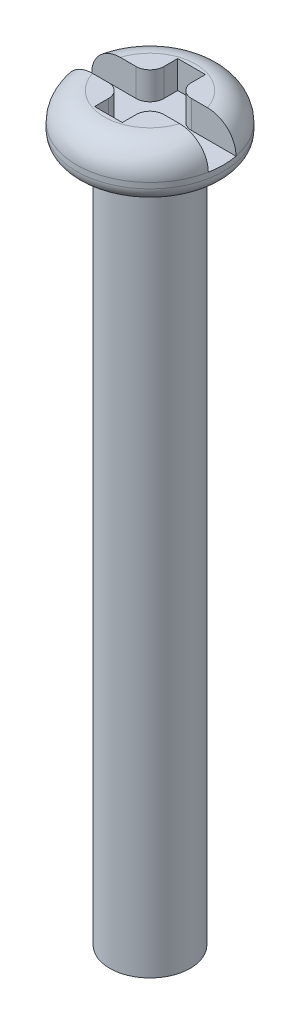
ISO-10303-21;
HEADER;
FILE_DESCRIPTION(('STEP AP214'),'2;1');
FILE_NAME('part.step','',(''),(''),'','','');
FILE_SCHEMA(('AUTOMOTIVE_DESIGN { 1 0 10303 214 1 1 1 1 }'));
ENDSEC;
DATA;
#1=APPLICATION_CONTEXT('core data for automotive mechanical design processes');
#2=APPLICATION_PROTOCOL_DEFINITION('international standard','automotive_design',2000,#1);
#3=PRODUCT_CONTEXT('',#1,'mechanical');
#4=PRODUCT('Part','Part','',(#3));
#5=PRODUCT_RELATED_PRODUCT_CATEGORY('part','',(#4));
#6=PRODUCT_DEFINITION_FORMATION('','',#4);
#7=PRODUCT_DEFINITION_CONTEXT('part definition',#1,'design');
#8=PRODUCT_DEFINITION('design','',#6,#7);
#9=PRODUCT_DEFINITION_SHAPE('','',#8);
#10=(LENGTH_UNIT() NAMED_UNIT(*) SI_UNIT(.MILLI.,.METRE.));
#11=(NAMED_UNIT(*) PLANE_ANGLE_UNIT() SI_UNIT($,.RADIAN.));
#12=(NAMED_UNIT(*) SI_UNIT($,.STERADIAN.) SOLID_ANGLE_UNIT());
#13=UNCERTAINTY_MEASURE_WITH_UNIT(LENGTH_MEASURE(1.E-05),#10,'distance_accuracy_value','');
#14=(GEOMETRIC_REPRESENTATION_CONTEXT(3) GLOBAL_UNCERTAINTY_ASSIGNED_CONTEXT((#13)) GLOBAL_UNIT_ASSIGNED_CONTEXT((#10,
#11,#12)) REPRESENTATION_CONTEXT('',''));
#15=CARTESIAN_POINT('',(0.,0.,0.));
#16=DIRECTION('',(0.,0.,1.));
#17=DIRECTION('',(1.,0.,0.));
#18=AXIS2_PLACEMENT_3D('',#15,#16,#17);
#19=CARTESIAN_POINT('',(0.,26.7,0.));
#20=DIRECTION('',(0.,-1.,0.));
#21=DIRECTION('',(0.,0.,-1.));
#22=AXIS2_PLACEMENT_3D('',#19,#20,#21);
#23=CYLINDRICAL_SURFACE('',#22,2.65);
#24=CARTESIAN_POINT('',(0.,25.5,0.));
#25=DIRECTION('',(0.,1.,0.));
#26=DIRECTION('',(0.,0.,1.));
#27=AXIS2_PLACEMENT_3D('',#24,#25,#26);
#28=CIRCLE('',#27,2.65);
#29=CARTESIAN_POINT('',(0.,25.5,2.65));
#30=VERTEX_POINT('',#29);
#31=EDGE_CURVE('E46',#30,#30,#28,.T.);
#32=ORIENTED_EDGE('',*,*,#31,.T.);
#33=EDGE_LOOP('',(#32));
#34=FACE_BOUND('',#33,.T.);
#35=CARTESIAN_POINT('',(0.,25.7,0.));
#36=DIRECTION('',(0.,1.,0.));
#37=DIRECTION('',(0.,0.,1.));
#38=AXIS2_PLACEMENT_3D('',#35,#36,#37);
#39=CIRCLE('',#38,2.65);
#40=CARTESIAN_POINT('',(-2.60240273593462,25.7,-0.5));
#41=VERTEX_POINT('',#40);
#42=CARTESIAN_POINT('',(-2.60240273593462,25.7,0.5));
#43=VERTEX_POINT('',#42);
#44=EDGE_CURVE('E176',#41,#43,#39,.T.);
#45=ORIENTED_EDGE('',*,*,#44,.F.);
#46=CARTESIAN_POINT('',(0.,25.7,0.));
#47=DIRECTION('',(0.,1.,0.));
#48=DIRECTION('',(0.,0.,1.));
#49=AXIS2_PLACEMENT_3D('',#46,#47,#48);
#50=CIRCLE('',#49,2.65);
#51=CARTESIAN_POINT('',(2.60240273593462,25.7,-0.5));
#52=VERTEX_POINT('',#51);
#53=EDGE_CURVE('E312',#41,#52,#50,.F.);
#54=ORIENTED_EDGE('',*,*,#53,.T.);
#55=CARTESIAN_POINT('',(0.,25.7,0.));
#56=DIRECTION('',(0.,1.,0.));
#57=DIRECTION('',(0.,0.,1.));
#58=AXIS2_PLACEMENT_3D('',#55,#56,#57);
#59=CIRCLE('',#58,2.65);
#60=CARTESIAN_POINT('',(2.60240273593462,25.7,0.5));
#61=VERTEX_POINT('',#60);
#62=EDGE_CURVE('E189',#61,#52,#59,.T.);
#63=ORIENTED_EDGE('',*,*,#62,.F.);
#64=CARTESIAN_POINT('',(0.,25.7,0.));
#65=DIRECTION('',(0.,1.,0.));
#66=DIRECTION('',(0.,0.,1.));
#67=AXIS2_PLACEMENT_3D('',#64,#65,#66);
#68=CIRCLE('',#67,2.65);
#69=EDGE_CURVE('E288',#61,#43,#68,.F.);
#70=ORIENTED_EDGE('',*,*,#69,.T.);
#71=EDGE_LOOP('',(#45,#54,#63,#70));
#72=FACE_BOUND('',#71,.T.);
#73=ADVANCED_FACE('F38',(#34,#72),#23,.T.);
#74=CARTESIAN_POINT('',(0.,26.7,0.));
#75=DIRECTION('',(0.,1.,0.));
#76=DIRECTION('',(0.,0.,1.));
#77=AXIS2_PLACEMENT_3D('',#74,#75,#76);
#78=PLANE('',#77);
#79=DIRECTION('',(1.,0.,0.));
#80=VECTOR('',#79,1.);
#81=CARTESIAN_POINT('',(0.,26.7,-0.5));
#82=LINE('',#81,#80);
#83=CARTESIAN_POINT('',(1.,26.7,-0.5));
#84=VERTEX_POINT('',#83);
#85=CARTESIAN_POINT('',(1.57241851935164,26.7,-0.5));
#86=VERTEX_POINT('',#85);
#87=EDGE_CURVE('E218',#84,#86,#82,.T.);
#88=ORIENTED_EDGE('',*,*,#87,.T.);
#89=CARTESIAN_POINT('',(0.,26.7,0.));
#90=DIRECTION('',(0.,1.,0.));
#91=DIRECTION('',(0.,0.,1.));
#92=AXIS2_PLACEMENT_3D('',#89,#90,#91);
#93=CIRCLE('',#92,1.65);
#94=CARTESIAN_POINT('',(-1.57241851935164,26.7,-0.5));
#95=VERTEX_POINT('',#94);
#96=EDGE_CURVE('E278',#86,#95,#93,.T.);
#97=ORIENTED_EDGE('',*,*,#96,.T.);
#98=DIRECTION('',(1.,0.,0.));
#99=VECTOR('',#98,1.);
#100=CARTESIAN_POINT('',(0.,26.7,-0.5));
#101=LINE('',#100,#99);
#102=CARTESIAN_POINT('',(-0.999999999999998,26.7,-0.5));
#103=VERTEX_POINT('',#102);
#104=EDGE_CURVE('E230',#95,#103,#101,.T.);
#105=ORIENTED_EDGE('',*,*,#104,.T.);
#106=CARTESIAN_POINT('',(-0.999999999999998,26.7,-1.));
#107=DIRECTION('',(0.,1.,0.));
#108=DIRECTION('',(0.,0.,1.));
#109=AXIS2_PLACEMENT_3D('',#106,#107,#108);
#110=CIRCLE('',#109,0.5);
#111=CARTESIAN_POINT('',(-0.499999999999998,26.7,-1.));
#112=VERTEX_POINT('',#111);
#113=EDGE_CURVE('E246',#103,#112,#110,.T.);
#114=ORIENTED_EDGE('',*,*,#113,.T.);
#115=DIRECTION('',(0.,0.,1.));
#116=VECTOR('',#115,1.);
#117=CARTESIAN_POINT('',(-0.499999999999998,26.7,0.));
#118=LINE('',#117,#116);
#119=CARTESIAN_POINT('',(-0.499999999999998,26.7,-1.5));
#120=VERTEX_POINT('',#119);
#121=EDGE_CURVE('E227',#120,#112,#118,.T.);
#122=ORIENTED_EDGE('',*,*,#121,.F.);
#123=DIRECTION('',(1.,0.,0.));
#124=VECTOR('',#123,1.);
#125=CARTESIAN_POINT('',(0.,26.7,-1.5));
#126=LINE('',#125,#124);
#127=CARTESIAN_POINT('',(0.500000000000002,26.7,-1.5));
#128=VERTEX_POINT('',#127);
#129=EDGE_CURVE('E224',#120,#128,#126,.T.);
#130=ORIENTED_EDGE('',*,*,#129,.T.);
#131=DIRECTION('',(0.,0.,1.));
#132=VECTOR('',#131,1.);
#133=CARTESIAN_POINT('',(0.500000000000002,26.7,0.));
#134=LINE('',#133,#132);
#135=CARTESIAN_POINT('',(0.500000000000002,26.7,-1.));
#136=VERTEX_POINT('',#135);
#137=EDGE_CURVE('E221',#128,#136,#134,.T.);
#138=ORIENTED_EDGE('',*,*,#137,.T.);
#139=CARTESIAN_POINT('',(1.,26.7,-1.));
#140=DIRECTION('',(0.,1.,0.));
#141=DIRECTION('',(0.,0.,1.));
#142=AXIS2_PLACEMENT_3D('',#139,#140,#141);
#143=CIRCLE('',#142,0.5);
#144=EDGE_CURVE('E248',#136,#84,#143,.T.);
#145=ORIENTED_EDGE('',*,*,#144,.T.);
#146=EDGE_LOOP('',(#88,#97,#105,#114,#122,#130,#138,#145));
#147=FACE_BOUND('',#146,.T.);
#148=ADVANCED_FACE('F348',(#147),#78,.T.);
#149=CARTESIAN_POINT('',(0.,25.,0.));
#150=DIRECTION('',(0.,-1.,0.));
#151=DIRECTION('',(0.,0.,-1.));
#152=AXIS2_PLACEMENT_3D('',#149,#150,#151);
#153=CYLINDRICAL_SURFACE('',#152,1.45);
#154=CARTESIAN_POINT('',(0.,25.,0.));
#155=DIRECTION('',(0.,1.,0.));
#156=DIRECTION('',(0.,0.,1.));
#157=AXIS2_PLACEMENT_3D('',#154,#155,#156);
#158=CIRCLE('',#157,1.45);
#159=CARTESIAN_POINT('',(0.,25.,1.45));
#160=VERTEX_POINT('',#159);
#161=EDGE_CURVE('E238',#160,#160,#158,.T.);
#162=ORIENTED_EDGE('',*,*,#161,.F.);
#163=EDGE_LOOP('',(#162));
#164=FACE_BOUND('',#163,.T.);
#165=CARTESIAN_POINT('',(0.,0.,0.));
#166=DIRECTION('',(0.,1.,0.));
#167=DIRECTION('',(0.,0.,1.));
#168=AXIS2_PLACEMENT_3D('',#165,#166,#167);
#169=CIRCLE('',#168,1.45);
#170=CARTESIAN_POINT('',(0.,0.,1.45));
#171=VERTEX_POINT('',#170);
#172=EDGE_CURVE('E234',#171,#171,#169,.T.);
#173=ORIENTED_EDGE('',*,*,#172,.T.);
#174=EDGE_LOOP('',(#173));
#175=FACE_BOUND('',#174,.T.);
#176=ADVANCED_FACE('F357',(#164,#175),#153,.T.);
#177=CARTESIAN_POINT('',(0.,0.,0.));
#178=DIRECTION('',(0.,1.,0.));
#179=DIRECTION('',(0.,0.,1.));
#180=AXIS2_PLACEMENT_3D('',#177,#178,#179);
#181=PLANE('',#180);
#182=ORIENTED_EDGE('',*,*,#172,.F.);
#183=EDGE_LOOP('',(#182));
#184=FACE_BOUND('',#183,.T.);
#185=ADVANCED_FACE('F346',(#184),#181,.F.);
#186=DIRECTION('',(1.,0.,0.));
#187=VECTOR('',#186,1.);
#188=CARTESIAN_POINT('',(0.,26.7,0.5));
#189=LINE('',#188,#187);
#190=CARTESIAN_POINT('',(-1.57241851935164,26.7,0.5));
#191=VERTEX_POINT('',#190);
#192=CARTESIAN_POINT('',(-0.999999999999998,26.7,0.5));
#193=VERTEX_POINT('',#192);
#194=EDGE_CURVE('E208',#191,#193,#189,.T.);
#195=ORIENTED_EDGE('',*,*,#194,.F.);
#196=CARTESIAN_POINT('',(0.,26.7,0.));
#197=DIRECTION('',(0.,1.,0.));
#198=DIRECTION('',(0.,0.,1.));
#199=AXIS2_PLACEMENT_3D('',#196,#197,#198);
#200=CIRCLE('',#199,1.65);
#201=CARTESIAN_POINT('',(1.57241851935164,26.7,0.5));
#202=VERTEX_POINT('',#201);
#203=EDGE_CURVE('E311',#191,#202,#200,.T.);
#204=ORIENTED_EDGE('',*,*,#203,.T.);
#205=DIRECTION('',(1.,0.,0.));
#206=VECTOR('',#205,1.);
#207=CARTESIAN_POINT('',(0.,26.7,0.5));
#208=LINE('',#207,#206);
#209=CARTESIAN_POINT('',(1.,26.7,0.5));
#210=VERTEX_POINT('',#209);
#211=EDGE_CURVE('E215',#210,#202,#208,.T.);
#212=ORIENTED_EDGE('',*,*,#211,.F.);
#213=CARTESIAN_POINT('',(1.,26.7,1.));
#214=DIRECTION('',(0.,1.,0.));
#215=DIRECTION('',(0.,0.,1.));
#216=AXIS2_PLACEMENT_3D('',#213,#214,#215);
#217=CIRCLE('',#216,0.5);
#218=CARTESIAN_POINT('',(0.500000000000002,26.7,1.));
#219=VERTEX_POINT('',#218);
#220=EDGE_CURVE('E258',#210,#219,#217,.T.);
#221=ORIENTED_EDGE('',*,*,#220,.T.);
#222=DIRECTION('',(0.,0.,1.));
#223=VECTOR('',#222,1.);
#224=CARTESIAN_POINT('',(0.500000000000002,26.7,0.));
#225=LINE('',#224,#223);
#226=CARTESIAN_POINT('',(0.500000000000002,26.7,1.5));
#227=VERTEX_POINT('',#226);
#228=EDGE_CURVE('E213',#219,#227,#225,.T.);
#229=ORIENTED_EDGE('',*,*,#228,.T.);
#230=DIRECTION('',(1.,0.,0.));
#231=VECTOR('',#230,1.);
#232=CARTESIAN_POINT('',(0.,26.7,1.5));
#233=LINE('',#232,#231);
#234=CARTESIAN_POINT('',(-0.499999999999998,26.7,1.5));
#235=VERTEX_POINT('',#234);
#236=EDGE_CURVE('E211',#235,#227,#233,.T.);
#237=ORIENTED_EDGE('',*,*,#236,.F.);
#238=DIRECTION('',(0.,0.,1.));
#239=VECTOR('',#238,1.);
#240=CARTESIAN_POINT('',(-0.499999999999998,26.7,0.));
#241=LINE('',#240,#239);
#242=CARTESIAN_POINT('',(-0.499999999999998,26.7,1.));
#243=VERTEX_POINT('',#242);
#244=EDGE_CURVE('E171',#243,#235,#241,.T.);
#245=ORIENTED_EDGE('',*,*,#244,.F.);
#246=CARTESIAN_POINT('',(-0.999999999999998,26.7,1.));
#247=DIRECTION('',(0.,1.,0.));
#248=DIRECTION('',(0.,0.,1.));
#249=AXIS2_PLACEMENT_3D('',#246,#247,#248);
#250=CIRCLE('',#249,0.5);
#251=EDGE_CURVE('E255',#243,#193,#250,.T.);
#252=ORIENTED_EDGE('',*,*,#251,.T.);
#253=EDGE_LOOP('',(#195,#204,#212,#221,#229,#237,#245,#252));
#254=FACE_BOUND('',#253,.T.);
#255=ADVANCED_FACE('F343',(#254),#78,.T.);
#256=CARTESIAN_POINT('',(0.,25.,0.));
#257=DIRECTION('',(0.,1.,0.));
#258=DIRECTION('',(0.,0.,1.));
#259=AXIS2_PLACEMENT_3D('',#256,#257,#258);
#260=PLANE('',#259);
#261=CARTESIAN_POINT('',(0.,25.,0.));
#262=DIRECTION('',(0.,1.,0.));
#263=DIRECTION('',(0.,0.,1.));
#264=AXIS2_PLACEMENT_3D('',#261,#262,#263);
#265=CIRCLE('',#264,2.15);
#266=CARTESIAN_POINT('',(0.,25.,2.15));
#267=VERTEX_POINT('',#266);
#268=EDGE_CURVE('E11',#267,#267,#265,.F.);
#269=ORIENTED_EDGE('',*,*,#268,.T.);
#270=EDGE_LOOP('',(#269));
#271=FACE_BOUND('',#270,.T.);
#272=ORIENTED_EDGE('',*,*,#161,.T.);
#273=EDGE_LOOP('',(#272));
#274=FACE_BOUND('',#273,.T.);
#275=ADVANCED_FACE('F342',(#271,#274),#260,.F.);
#276=CARTESIAN_POINT('',(0.,25.7,0.5));
#277=DIRECTION('',(0.,0.,1.));
#278=DIRECTION('',(1.,0.,0.));
#279=AXIS2_PLACEMENT_3D('',#276,#277,#278);
#280=PLANE('',#279);
#281=DIRECTION('',(1.,0.,0.));
#282=VECTOR('',#281,1.);
#283=CARTESIAN_POINT('',(0.,25.7,0.5));
#284=LINE('',#283,#282);
#285=CARTESIAN_POINT('',(-0.999999999999998,25.7,0.5));
#286=VERTEX_POINT('',#285);
#287=EDGE_CURVE('E165',#43,#286,#284,.T.);
#288=ORIENTED_EDGE('',*,*,#287,.F.);
#289=CARTESIAN_POINT('',(-2.60240273593462,25.7,0.5));
#290=CARTESIAN_POINT('',(-2.60240271377349,25.7277233920339,0.5));
#291=CARTESIAN_POINT('',(-2.60122801729266,25.7554334195427,0.5));
#292=CARTESIAN_POINT('',(-2.59654280781609,25.8106532908481,0.5));
#293=CARTESIAN_POINT('',(-2.59303246119301,25.8381631487621,0.5));
#294=CARTESIAN_POINT('',(-2.57903698718193,25.9200271355584,0.5));
#295=CARTESIAN_POINT('',(-2.56508729699177,25.9738298073651,0.5));
#296=CARTESIAN_POINT('',(-2.5283625310278,26.0783226368844,0.5));
#297=CARTESIAN_POINT('',(-2.50558424231885,26.1290116536757,0.5));
#298=CARTESIAN_POINT('',(-2.45188716247569,26.2258776126128,0.5));
#299=CARTESIAN_POINT('',(-2.42096884477329,26.2720548169558,0.5));
#300=CARTESIAN_POINT('',(-2.35171254473002,26.3588872220542,0.5));
#301=CARTESIAN_POINT('',(-2.31333345000452,26.3995095969634,0.5));
#302=CARTESIAN_POINT('',(-2.23039665529566,26.4738617431333,0.5));
#303=CARTESIAN_POINT('',(-2.18583836657574,26.5075908568647,0.5));
#304=CARTESIAN_POINT('',(-2.0910398689415,26.5678296050896,0.5));
#305=CARTESIAN_POINT('',(-2.04071716490879,26.5942092000688,0.5));
#306=CARTESIAN_POINT('',(-1.93643663883839,26.6384082235956,0.5));
#307=CARTESIAN_POINT('',(-1.8824785686269,26.656227067054,0.5));
#308=CARTESIAN_POINT('',(-1.78572977369662,26.6797735573003,0.5));
#309=CARTESIAN_POINT('',(-1.74338359439109,26.6873807028732,0.5));
#310=CARTESIAN_POINT('',(-1.65816460280393,26.6974952410711,0.5));
#311=CARTESIAN_POINT('',(-1.6152929136472,26.700012071318,0.5));
#312=CARTESIAN_POINT('',(-1.57241851935164,26.7,0.5));
#313=B_SPLINE_CURVE_WITH_KNOTS('',3,(#289,#290,#291,#292,#293,#294,#295,#296,#297,#298,#299,
#300,#301,#302,#303,#304,#305,#306,#307,#308,#309,#310,#311,#312),.UNSPECIFIED.,.F.,.F.,(4,2,2,
2,2,2,2,2,2,2,2,4),(0.,0.0831187963338425,0.166231672596129,0.332119418843782,0.498067592323711,
0.664006116231715,0.830886377215973,0.997782549029222,1.16746723663915,1.33716351979238,
1.46594086014767,1.59447922314912),.UNSPECIFIED.);
#314=EDGE_CURVE('E53',#43,#191,#313,.T.);
#315=ORIENTED_EDGE('',*,*,#314,.T.);
#316=ORIENTED_EDGE('',*,*,#194,.T.);
#317=DIRECTION('',(0.,1.,0.));
#318=VECTOR('',#317,1.);
#319=CARTESIAN_POINT('',(-0.999999999999998,25.7,0.5));
#320=LINE('',#319,#318);
#321=EDGE_CURVE('E269',#193,#286,#320,.F.);
#322=ORIENTED_EDGE('',*,*,#321,.T.);
#323=EDGE_LOOP('',(#288,#315,#316,#322));
#324=FACE_BOUND('',#323,.T.);
#325=ADVANCED_FACE('F337',(#324),#280,.F.);
#326=CARTESIAN_POINT('',(0.,25.7,-0.5));
#327=DIRECTION('',(0.,0.,1.));
#328=DIRECTION('',(1.,0.,0.));
#329=AXIS2_PLACEMENT_3D('',#326,#327,#328);
#330=PLANE('',#329);
#331=ORIENTED_EDGE('',*,*,#104,.F.);
#332=CARTESIAN_POINT('',(-1.57241851935164,26.7,-0.5));
#333=CARTESIAN_POINT('',(-1.60770139870429,26.7000067033325,-0.5));
#334=CARTESIAN_POINT('',(-1.64298829471572,26.6983040998687,-0.5));
#335=CARTESIAN_POINT('',(-1.71324403476619,26.6914645259334,-0.5));
#336=CARTESIAN_POINT('',(-1.74821271764584,26.6863259038044,-0.5));
#337=CARTESIAN_POINT('',(-1.8174446290571,26.6726037992152,-0.5));
#338=CARTESIAN_POINT('',(-1.85170838095213,26.6640229770949,-0.5));
#339=CARTESIAN_POINT('',(-1.9191803533249,26.6434679167559,-0.5));
#340=CARTESIAN_POINT('',(-1.95238892909686,26.6314948345237,-0.5));
#341=CARTESIAN_POINT('',(-2.04032366949096,26.5946127544968,-0.5));
#342=CARTESIAN_POINT('',(-2.0937591037006,26.5665278834217,-0.5));
#343=CARTESIAN_POINT('',(-2.1947747160047,26.5014378838152,-0.5));
#344=CARTESIAN_POINT('',(-2.24236216900427,26.4644440112893,-0.5));
#345=CARTESIAN_POINT('',(-2.32828926899467,26.384352053454,-0.5));
#346=CARTESIAN_POINT('',(-2.36694051047202,26.3415883410075,-0.5));
#347=CARTESIAN_POINT('',(-2.43632908370486,26.2500177230673,-0.5));
#348=CARTESIAN_POINT('',(-2.46706268576305,26.2012079854949,-0.5));
#349=CARTESIAN_POINT('',(-2.51899980183911,26.1001880761521,-0.5));
#350=CARTESIAN_POINT('',(-2.54040618570087,26.0480818901324,-0.5));
#351=CARTESIAN_POINT('',(-2.57401762418166,25.9410263488932,-0.5));
#352=CARTESIAN_POINT('',(-2.58623625840321,25.8860813184936,-0.5));
#353=CARTESIAN_POINT('',(-2.59659120735172,25.8089088636295,-0.5));
#354=CARTESIAN_POINT('',(-2.59877127401443,25.7871649588043,-0.5));
#355=CARTESIAN_POINT('',(-2.60167526097895,25.7436173286168,-0.5));
#356=CARTESIAN_POINT('',(-2.60240165734286,25.7218137684281,-0.5));
#357=CARTESIAN_POINT('',(-2.60240273593464,25.7,-0.5));
#358=B_SPLINE_CURVE_WITH_KNOTS('',3,(#332,#333,#334,#335,#336,#337,#338,#339,#340,#341,#342,
#343,#344,#345,#346,#347,#348,#349,#350,#351,#352,#353,#354,#355,#356,#357),.UNSPECIFIED.,.F.,
.F.,(4,2,2,2,2,2,2,2,2,2,2,2,4),(0.,0.105812893977517,0.211676687679539,0.317458820598544,
0.423204949221232,0.603314200124927,0.783197076405821,0.955277480615487,1.12743879771521,
1.29564176426739,1.46359563353078,1.52911617882008,1.59452502650191),.UNSPECIFIED.);
#359=EDGE_CURVE('E281',#95,#41,#358,.T.);
#360=ORIENTED_EDGE('',*,*,#359,.T.);
#361=DIRECTION('',(1.,0.,0.));
#362=VECTOR('',#361,1.);
#363=CARTESIAN_POINT('',(0.,25.7,-0.5));
#364=LINE('',#363,#362);
#365=CARTESIAN_POINT('',(-0.999999999999998,25.7,-0.5));
#366=VERTEX_POINT('',#365);
#367=EDGE_CURVE('E203',#41,#366,#364,.T.);
#368=ORIENTED_EDGE('',*,*,#367,.T.);
#369=DIRECTION('',(0.,1.,0.));
#370=VECTOR('',#369,1.);
#371=CARTESIAN_POINT('',(-0.999999999999998,26.7,-0.5));
#372=LINE('',#371,#370);
#373=EDGE_CURVE('E262',#366,#103,#372,.T.);
#374=ORIENTED_EDGE('',*,*,#373,.T.);
#375=EDGE_LOOP('',(#331,#360,#368,#374));
#376=FACE_BOUND('',#375,.T.);
#377=ADVANCED_FACE('F290',(#376),#330,.T.);
#378=CARTESIAN_POINT('',(-0.499999999999998,25.7,0.));
#379=DIRECTION('',(-1.,0.,0.));
#380=DIRECTION('',(0.,0.,1.));
#381=AXIS2_PLACEMENT_3D('',#378,#379,#380);
#382=PLANE('',#381);
#383=ORIENTED_EDGE('',*,*,#121,.T.);
#384=DIRECTION('',(0.,1.,0.));
#385=VECTOR('',#384,1.);
#386=CARTESIAN_POINT('',(-0.499999999999998,25.7,-1.));
#387=LINE('',#386,#385);
#388=CARTESIAN_POINT('',(-0.499999999999998,25.7,-1.));
#389=VERTEX_POINT('',#388);
#390=EDGE_CURVE('E265',#112,#389,#387,.F.);
#391=ORIENTED_EDGE('',*,*,#390,.T.);
#392=DIRECTION('',(0.,0.,1.));
#393=VECTOR('',#392,1.);
#394=CARTESIAN_POINT('',(-0.499999999999998,25.7,0.));
#395=LINE('',#394,#393);
#396=CARTESIAN_POINT('',(-0.499999999999998,25.7,-1.5));
#397=VERTEX_POINT('',#396);
#398=EDGE_CURVE('E200',#397,#389,#395,.T.);
#399=ORIENTED_EDGE('',*,*,#398,.F.);
#400=DIRECTION('',(0.,1.,0.));
#401=VECTOR('',#400,1.);
#402=CARTESIAN_POINT('',(-0.499999999999998,25.7,-1.5));
#403=LINE('',#402,#401);
#404=EDGE_CURVE('E232',#397,#120,#403,.T.);
#405=ORIENTED_EDGE('',*,*,#404,.T.);
#406=EDGE_LOOP('',(#383,#391,#399,#405));
#407=FACE_BOUND('',#406,.T.);
#408=ADVANCED_FACE('F404',(#407),#382,.F.);
#409=CARTESIAN_POINT('',(0.,25.7,-1.5));
#410=DIRECTION('',(0.,0.,1.));
#411=DIRECTION('',(1.,0.,0.));
#412=AXIS2_PLACEMENT_3D('',#409,#410,#411);
#413=PLANE('',#412);
#414=ORIENTED_EDGE('',*,*,#129,.F.);
#415=ORIENTED_EDGE('',*,*,#404,.F.);
#416=DIRECTION('',(1.,0.,0.));
#417=VECTOR('',#416,1.);
#418=CARTESIAN_POINT('',(0.,25.7,-1.5));
#419=LINE('',#418,#417);
#420=CARTESIAN_POINT('',(0.500000000000002,25.7,-1.5));
#421=VERTEX_POINT('',#420);
#422=EDGE_CURVE('E198',#397,#421,#419,.T.);
#423=ORIENTED_EDGE('',*,*,#422,.T.);
#424=DIRECTION('',(0.,1.,0.));
#425=VECTOR('',#424,1.);
#426=CARTESIAN_POINT('',(0.500000000000002,25.7,-1.5));
#427=LINE('',#426,#425);
#428=EDGE_CURVE('E235',#421,#128,#427,.T.);
#429=ORIENTED_EDGE('',*,*,#428,.T.);
#430=EDGE_LOOP('',(#414,#415,#423,#429));
#431=FACE_BOUND('',#430,.T.);
#432=ADVANCED_FACE('F401',(#431),#413,.T.);
#433=CARTESIAN_POINT('',(0.500000000000002,25.7,0.));
#434=DIRECTION('',(-1.,0.,0.));
#435=DIRECTION('',(0.,0.,1.));
#436=AXIS2_PLACEMENT_3D('',#433,#434,#435);
#437=PLANE('',#436);
#438=DIRECTION('',(0.,0.,1.));
#439=VECTOR('',#438,1.);
#440=CARTESIAN_POINT('',(0.500000000000002,25.7,0.));
#441=LINE('',#440,#439);
#442=CARTESIAN_POINT('',(0.500000000000002,25.7,-1.));
#443=VERTEX_POINT('',#442);
#444=EDGE_CURVE('E195',#421,#443,#441,.T.);
#445=ORIENTED_EDGE('',*,*,#444,.T.);
#446=DIRECTION('',(0.,1.,0.));
#447=VECTOR('',#446,1.);
#448=CARTESIAN_POINT('',(0.500000000000002,25.7,-1.));
#449=LINE('',#448,#447);
#450=EDGE_CURVE('E241',#443,#136,#449,.T.);
#451=ORIENTED_EDGE('',*,*,#450,.T.);
#452=ORIENTED_EDGE('',*,*,#137,.F.);
#453=ORIENTED_EDGE('',*,*,#428,.F.);
#454=EDGE_LOOP('',(#445,#451,#452,#453));
#455=FACE_BOUND('',#454,.T.);
#456=ADVANCED_FACE('F320',(#455),#437,.T.);
#457=CARTESIAN_POINT('',(0.,25.7,-0.5));
#458=DIRECTION('',(0.,0.,1.));
#459=DIRECTION('',(1.,0.,0.));
#460=AXIS2_PLACEMENT_3D('',#457,#458,#459);
#461=PLANE('',#460);
#462=DIRECTION('',(1.,0.,0.));
#463=VECTOR('',#462,1.);
#464=CARTESIAN_POINT('',(0.,25.7,-0.5));
#465=LINE('',#464,#463);
#466=CARTESIAN_POINT('',(1.,25.7,-0.5));
#467=VERTEX_POINT('',#466);
#468=EDGE_CURVE('E192',#467,#52,#465,.T.);
#469=ORIENTED_EDGE('',*,*,#468,.T.);
#470=CARTESIAN_POINT('',(2.60240273593462,25.7,-0.5));
#471=CARTESIAN_POINT('',(2.60240271377349,25.7277233920339,-0.5));
#472=CARTESIAN_POINT('',(2.60122801729266,25.7554334195427,-0.5));
#473=CARTESIAN_POINT('',(2.59654280781609,25.8106532908481,-0.5));
#474=CARTESIAN_POINT('',(2.59303246119301,25.8381631487621,-0.5));
#475=CARTESIAN_POINT('',(2.57903698718193,25.9200271355584,-0.5));
#476=CARTESIAN_POINT('',(2.56508729699177,25.9738298073651,-0.5));
#477=CARTESIAN_POINT('',(2.5283625310278,26.0783226368844,-0.5));
#478=CARTESIAN_POINT('',(2.50558424231885,26.1290116536757,-0.5));
#479=CARTESIAN_POINT('',(2.45188716247569,26.2258776126128,-0.5));
#480=CARTESIAN_POINT('',(2.42096884477329,26.2720548169558,-0.5));
#481=CARTESIAN_POINT('',(2.35171254473002,26.3588872220542,-0.5));
#482=CARTESIAN_POINT('',(2.31333345000452,26.3995095969634,-0.5));
#483=CARTESIAN_POINT('',(2.23039665529566,26.4738617431333,-0.5));
#484=CARTESIAN_POINT('',(2.18583836657574,26.5075908568647,-0.5));
#485=CARTESIAN_POINT('',(2.0910398689415,26.5678296050896,-0.5));
#486=CARTESIAN_POINT('',(2.04071716490879,26.5942092000688,-0.5));
#487=CARTESIAN_POINT('',(1.93643663883839,26.6384082235956,-0.5));
#488=CARTESIAN_POINT('',(1.8824785686269,26.656227067054,-0.5));
#489=CARTESIAN_POINT('',(1.78572977369662,26.6797735573003,-0.5));
#490=CARTESIAN_POINT('',(1.74338359439109,26.6873807028732,-0.5));
#491=CARTESIAN_POINT('',(1.65816460280393,26.6974952410711,-0.5));
#492=CARTESIAN_POINT('',(1.6152929136472,26.700012071318,-0.5));
#493=CARTESIAN_POINT('',(1.57241851935164,26.7,-0.5));
#494=B_SPLINE_CURVE_WITH_KNOTS('',3,(#470,#471,#472,#473,#474,#475,#476,#477,#478,#479,#480,
#481,#482,#483,#484,#485,#486,#487,#488,#489,#490,#491,#492,#493),.UNSPECIFIED.,.F.,.F.,(4,2,2,
2,2,2,2,2,2,2,2,4),(0.,0.0831187963338425,0.166231672596129,0.332119418843782,0.498067592323711,
0.664006116231715,0.830886377215973,0.997782549029222,1.16746723663915,1.33716351979238,
1.46594086014767,1.59447922314912),.UNSPECIFIED.);
#495=EDGE_CURVE('E305',#52,#86,#494,.T.);
#496=ORIENTED_EDGE('',*,*,#495,.T.);
#497=ORIENTED_EDGE('',*,*,#87,.F.);
#498=DIRECTION('',(0.,1.,0.));
#499=VECTOR('',#498,1.);
#500=CARTESIAN_POINT('',(1.,25.7,-0.5));
#501=LINE('',#500,#499);
#502=EDGE_CURVE('E250',#84,#467,#501,.F.);
#503=ORIENTED_EDGE('',*,*,#502,.T.);
#504=EDGE_LOOP('',(#469,#496,#497,#503));
#505=FACE_BOUND('',#504,.T.);
#506=ADVANCED_FACE('F314',(#505),#461,.T.);
#507=CARTESIAN_POINT('',(0.,25.7,0.5));
#508=DIRECTION('',(0.,0.,1.));
#509=DIRECTION('',(1.,0.,0.));
#510=AXIS2_PLACEMENT_3D('',#507,#508,#509);
#511=PLANE('',#510);
#512=ORIENTED_EDGE('',*,*,#211,.T.);
#513=CARTESIAN_POINT('',(1.57241851935164,26.7,0.5));
#514=CARTESIAN_POINT('',(1.60770139870429,26.7000067033325,0.5));
#515=CARTESIAN_POINT('',(1.64298829471572,26.6983040998687,0.5));
#516=CARTESIAN_POINT('',(1.71324403476619,26.6914645259334,0.5));
#517=CARTESIAN_POINT('',(1.74821271764584,26.6863259038044,0.5));
#518=CARTESIAN_POINT('',(1.8174446290571,26.6726037992152,0.5));
#519=CARTESIAN_POINT('',(1.85170838095213,26.6640229770949,0.5));
#520=CARTESIAN_POINT('',(1.9191803533249,26.6434679167559,0.5));
#521=CARTESIAN_POINT('',(1.95238892909686,26.6314948345237,0.5));
#522=CARTESIAN_POINT('',(2.04032366949096,26.5946127544968,0.5));
#523=CARTESIAN_POINT('',(2.0937591037006,26.5665278834217,0.5));
#524=CARTESIAN_POINT('',(2.1947747160047,26.5014378838152,0.5));
#525=CARTESIAN_POINT('',(2.24236216900427,26.4644440112893,0.5));
#526=CARTESIAN_POINT('',(2.32828926899467,26.384352053454,0.5));
#527=CARTESIAN_POINT('',(2.36694051047202,26.3415883410075,0.5));
#528=CARTESIAN_POINT('',(2.43632908370486,26.2500177230673,0.5));
#529=CARTESIAN_POINT('',(2.46706268576305,26.2012079854949,0.5));
#530=CARTESIAN_POINT('',(2.51899980183911,26.1001880761521,0.5));
#531=CARTESIAN_POINT('',(2.54040618570087,26.0480818901324,0.5));
#532=CARTESIAN_POINT('',(2.57401762418166,25.9410263488932,0.5));
#533=CARTESIAN_POINT('',(2.58623625840321,25.8860813184936,0.5));
#534=CARTESIAN_POINT('',(2.59659120735172,25.8089088636295,0.5));
#535=CARTESIAN_POINT('',(2.59877127401443,25.7871649588043,0.5));
#536=CARTESIAN_POINT('',(2.60167526097895,25.7436173286168,0.5));
#537=CARTESIAN_POINT('',(2.60240165734286,25.7218137684281,0.5));
#538=CARTESIAN_POINT('',(2.60240273593464,25.7,0.5));
#539=B_SPLINE_CURVE_WITH_KNOTS('',3,(#513,#514,#515,#516,#517,#518,#519,#520,#521,#522,#523,
#524,#525,#526,#527,#528,#529,#530,#531,#532,#533,#534,#535,#536,#537,#538),.UNSPECIFIED.,.F.,
.F.,(4,2,2,2,2,2,2,2,2,2,2,2,4),(0.,0.105812893977517,0.211676687679539,0.317458820598544,
0.423204949221232,0.603314200124927,0.783197076405821,0.955277480615487,1.12743879771521,
1.29564176426739,1.46359563353078,1.52911617882008,1.59452502650191),.UNSPECIFIED.);
#540=EDGE_CURVE('E61',#202,#61,#539,.T.);
#541=ORIENTED_EDGE('',*,*,#540,.T.);
#542=DIRECTION('',(1.,0.,0.));
#543=VECTOR('',#542,1.);
#544=CARTESIAN_POINT('',(0.,25.7,0.5));
#545=LINE('',#544,#543);
#546=CARTESIAN_POINT('',(1.,25.7,0.5));
#547=VERTEX_POINT('',#546);
#548=EDGE_CURVE('E183',#547,#61,#545,.T.);
#549=ORIENTED_EDGE('',*,*,#548,.F.);
#550=DIRECTION('',(0.,1.,0.));
#551=VECTOR('',#550,1.);
#552=CARTESIAN_POINT('',(1.,26.7,0.5));
#553=LINE('',#552,#551);
#554=EDGE_CURVE('E252',#547,#210,#553,.T.);
#555=ORIENTED_EDGE('',*,*,#554,.T.);
#556=EDGE_LOOP('',(#512,#541,#549,#555));
#557=FACE_BOUND('',#556,.T.);
#558=ADVANCED_FACE('F319',(#557),#511,.F.);
#559=CARTESIAN_POINT('',(0.500000000000002,25.7,0.));
#560=DIRECTION('',(-1.,0.,0.));
#561=DIRECTION('',(0.,0.,1.));
#562=AXIS2_PLACEMENT_3D('',#559,#560,#561);
#563=PLANE('',#562);
#564=ORIENTED_EDGE('',*,*,#228,.F.);
#565=DIRECTION('',(0.,1.,0.));
#566=VECTOR('',#565,1.);
#567=CARTESIAN_POINT('',(0.500000000000002,25.7,1.));
#568=LINE('',#567,#566);
#569=CARTESIAN_POINT('',(0.500000000000002,25.7,1.));
#570=VERTEX_POINT('',#569);
#571=EDGE_CURVE('E260',#219,#570,#568,.F.);
#572=ORIENTED_EDGE('',*,*,#571,.T.);
#573=DIRECTION('',(0.,0.,1.));
#574=VECTOR('',#573,1.);
#575=CARTESIAN_POINT('',(0.500000000000002,25.7,0.));
#576=LINE('',#575,#574);
#577=CARTESIAN_POINT('',(0.500000000000002,25.7,1.5));
#578=VERTEX_POINT('',#577);
#579=EDGE_CURVE('E181',#570,#578,#576,.T.);
#580=ORIENTED_EDGE('',*,*,#579,.T.);
#581=DIRECTION('',(0.,1.,0.));
#582=VECTOR('',#581,1.);
#583=CARTESIAN_POINT('',(0.500000000000002,25.7,1.5));
#584=LINE('',#583,#582);
#585=EDGE_CURVE('E175',#578,#227,#584,.T.);
#586=ORIENTED_EDGE('',*,*,#585,.T.);
#587=EDGE_LOOP('',(#564,#572,#580,#586));
#588=FACE_BOUND('',#587,.T.);
#589=ADVANCED_FACE('F326',(#588),#563,.T.);
#590=CARTESIAN_POINT('',(0.,25.7,1.5));
#591=DIRECTION('',(0.,0.,1.));
#592=DIRECTION('',(1.,0.,0.));
#593=AXIS2_PLACEMENT_3D('',#590,#591,#592);
#594=PLANE('',#593);
#595=ORIENTED_EDGE('',*,*,#236,.T.);
#596=ORIENTED_EDGE('',*,*,#585,.F.);
#597=DIRECTION('',(1.,0.,0.));
#598=VECTOR('',#597,1.);
#599=CARTESIAN_POINT('',(0.,25.7,1.5));
#600=LINE('',#599,#598);
#601=CARTESIAN_POINT('',(-0.499999999999998,25.7,1.5));
#602=VERTEX_POINT('',#601);
#603=EDGE_CURVE('E159',#602,#578,#600,.T.);
#604=ORIENTED_EDGE('',*,*,#603,.F.);
#605=DIRECTION('',(0.,1.,0.));
#606=VECTOR('',#605,1.);
#607=CARTESIAN_POINT('',(-0.499999999999998,25.7,1.5));
#608=LINE('',#607,#606);
#609=EDGE_CURVE('E168',#602,#235,#608,.T.);
#610=ORIENTED_EDGE('',*,*,#609,.T.);
#611=EDGE_LOOP('',(#595,#596,#604,#610));
#612=FACE_BOUND('',#611,.T.);
#613=ADVANCED_FACE('F179',(#612),#594,.F.);
#614=CARTESIAN_POINT('',(-0.499999999999998,25.7,0.));
#615=DIRECTION('',(-1.,0.,0.));
#616=DIRECTION('',(0.,0.,1.));
#617=AXIS2_PLACEMENT_3D('',#614,#615,#616);
#618=PLANE('',#617);
#619=DIRECTION('',(0.,0.,1.));
#620=VECTOR('',#619,1.);
#621=CARTESIAN_POINT('',(-0.499999999999998,25.7,0.));
#622=LINE('',#621,#620);
#623=CARTESIAN_POINT('',(-0.499999999999998,25.7,1.));
#624=VERTEX_POINT('',#623);
#625=EDGE_CURVE('E153',#624,#602,#622,.T.);
#626=ORIENTED_EDGE('',*,*,#625,.F.);
#627=DIRECTION('',(0.,1.,0.));
#628=VECTOR('',#627,1.);
#629=CARTESIAN_POINT('',(-0.499999999999998,25.7,1.));
#630=LINE('',#629,#628);
#631=EDGE_CURVE('E267',#624,#243,#630,.T.);
#632=ORIENTED_EDGE('',*,*,#631,.T.);
#633=ORIENTED_EDGE('',*,*,#244,.T.);
#634=ORIENTED_EDGE('',*,*,#609,.F.);
#635=EDGE_LOOP('',(#626,#632,#633,#634));
#636=FACE_BOUND('',#635,.T.);
#637=ADVANCED_FACE('F169',(#636),#618,.F.);
#638=CARTESIAN_POINT('',(0.,25.7,0.));
#639=DIRECTION('',(0.,1.,0.));
#640=DIRECTION('',(0.,0.,1.));
#641=AXIS2_PLACEMENT_3D('',#638,#639,#640);
#642=PLANE('',#641);
#643=ORIENTED_EDGE('',*,*,#287,.T.);
#644=CARTESIAN_POINT('',(-0.999999999999998,25.7,1.));
#645=DIRECTION('',(0.,1.,0.));
#646=DIRECTION('',(0.,0.,1.));
#647=AXIS2_PLACEMENT_3D('',#644,#645,#646);
#648=CIRCLE('',#647,0.5);
#649=EDGE_CURVE('E161',#286,#624,#648,.F.);
#650=ORIENTED_EDGE('',*,*,#649,.T.);
#651=ORIENTED_EDGE('',*,*,#625,.T.);
#652=ORIENTED_EDGE('',*,*,#603,.T.);
#653=ORIENTED_EDGE('',*,*,#579,.F.);
#654=CARTESIAN_POINT('',(1.,25.7,1.));
#655=DIRECTION('',(0.,1.,0.));
#656=DIRECTION('',(0.,0.,1.));
#657=AXIS2_PLACEMENT_3D('',#654,#655,#656);
#658=CIRCLE('',#657,0.5);
#659=EDGE_CURVE('E273',#570,#547,#658,.F.);
#660=ORIENTED_EDGE('',*,*,#659,.T.);
#661=ORIENTED_EDGE('',*,*,#548,.T.);
#662=ORIENTED_EDGE('',*,*,#62,.T.);
#663=ORIENTED_EDGE('',*,*,#468,.F.);
#664=CARTESIAN_POINT('',(1.,25.7,-1.));
#665=DIRECTION('',(0.,1.,0.));
#666=DIRECTION('',(0.,0.,1.));
#667=AXIS2_PLACEMENT_3D('',#664,#665,#666);
#668=CIRCLE('',#667,0.5);
#669=EDGE_CURVE('E271',#467,#443,#668,.F.);
#670=ORIENTED_EDGE('',*,*,#669,.T.);
#671=ORIENTED_EDGE('',*,*,#444,.F.);
#672=ORIENTED_EDGE('',*,*,#422,.F.);
#673=ORIENTED_EDGE('',*,*,#398,.T.);
#674=CARTESIAN_POINT('',(-0.999999999999998,25.7,-1.));
#675=DIRECTION('',(0.,1.,0.));
#676=DIRECTION('',(0.,0.,1.));
#677=AXIS2_PLACEMENT_3D('',#674,#675,#676);
#678=CIRCLE('',#677,0.5);
#679=EDGE_CURVE('E275',#389,#366,#678,.F.);
#680=ORIENTED_EDGE('',*,*,#679,.T.);
#681=ORIENTED_EDGE('',*,*,#367,.F.);
#682=ORIENTED_EDGE('',*,*,#44,.T.);
#683=EDGE_LOOP('',(#643,#650,#651,#652,#653,#660,#661,#662,#663,#670,#671,#672,#673,#680,#681,#682));
#684=FACE_BOUND('',#683,.T.);
#685=ADVANCED_FACE('F156',(#684),#642,.T.);
#686=CARTESIAN_POINT('',(1.,25.7,-1.));
#687=DIRECTION('',(0.,1.,0.));
#688=DIRECTION('',(0.,0.,1.));
#689=AXIS2_PLACEMENT_3D('',#686,#687,#688);
#690=CYLINDRICAL_SURFACE('',#689,0.5);
#691=ORIENTED_EDGE('',*,*,#669,.F.);
#692=ORIENTED_EDGE('',*,*,#502,.F.);
#693=ORIENTED_EDGE('',*,*,#144,.F.);
#694=ORIENTED_EDGE('',*,*,#450,.F.);
#695=EDGE_LOOP('',(#691,#692,#693,#694));
#696=FACE_BOUND('',#695,.T.);
#697=ADVANCED_FACE('F362',(#696),#690,.T.);
#698=CARTESIAN_POINT('',(1.,25.7,1.));
#699=DIRECTION('',(0.,-1.,0.));
#700=DIRECTION('',(0.,0.,-1.));
#701=AXIS2_PLACEMENT_3D('',#698,#699,#700);
#702=CYLINDRICAL_SURFACE('',#701,0.5);
#703=ORIENTED_EDGE('',*,*,#659,.F.);
#704=ORIENTED_EDGE('',*,*,#571,.F.);
#705=ORIENTED_EDGE('',*,*,#220,.F.);
#706=ORIENTED_EDGE('',*,*,#554,.F.);
#707=EDGE_LOOP('',(#703,#704,#705,#706));
#708=FACE_BOUND('',#707,.T.);
#709=ADVANCED_FACE('F365',(#708),#702,.T.);
#710=CARTESIAN_POINT('',(-0.999999999999998,25.7,-1.));
#711=DIRECTION('',(0.,-1.,0.));
#712=DIRECTION('',(0.,0.,-1.));
#713=AXIS2_PLACEMENT_3D('',#710,#711,#712);
#714=CYLINDRICAL_SURFACE('',#713,0.5);
#715=ORIENTED_EDGE('',*,*,#679,.F.);
#716=ORIENTED_EDGE('',*,*,#390,.F.);
#717=ORIENTED_EDGE('',*,*,#113,.F.);
#718=ORIENTED_EDGE('',*,*,#373,.F.);
#719=EDGE_LOOP('',(#715,#716,#717,#718));
#720=FACE_BOUND('',#719,.T.);
#721=ADVANCED_FACE('F368',(#720),#714,.T.);
#722=CARTESIAN_POINT('',(-0.999999999999998,25.7,1.));
#723=DIRECTION('',(0.,1.,0.));
#724=DIRECTION('',(0.,0.,1.));
#725=AXIS2_PLACEMENT_3D('',#722,#723,#724);
#726=CYLINDRICAL_SURFACE('',#725,0.5);
#727=ORIENTED_EDGE('',*,*,#649,.F.);
#728=ORIENTED_EDGE('',*,*,#321,.F.);
#729=ORIENTED_EDGE('',*,*,#251,.F.);
#730=ORIENTED_EDGE('',*,*,#631,.F.);
#731=EDGE_LOOP('',(#727,#728,#729,#730));
#732=FACE_BOUND('',#731,.T.);
#733=ADVANCED_FACE('F299',(#732),#726,.T.);
#734=CARTESIAN_POINT('',(0.,25.7,0.));
#735=DIRECTION('',(0.,1.,0.));
#736=DIRECTION('',(0.,0.,1.));
#737=AXIS2_PLACEMENT_3D('',#734,#735,#736);
#738=TOROIDAL_SURFACE('',#737,1.65,1.);
#739=ORIENTED_EDGE('',*,*,#495,.F.);
#740=ORIENTED_EDGE('',*,*,#53,.F.);
#741=ORIENTED_EDGE('',*,*,#359,.F.);
#742=ORIENTED_EDGE('',*,*,#96,.F.);
#743=EDGE_LOOP('',(#739,#740,#741,#742));
#744=FACE_BOUND('',#743,.T.);
#745=ADVANCED_FACE('F294',(#744),#738,.T.);
#746=CARTESIAN_POINT('',(0.,25.7,0.));
#747=DIRECTION('',(0.,1.,0.));
#748=DIRECTION('',(0.,0.,1.));
#749=AXIS2_PLACEMENT_3D('',#746,#747,#748);
#750=TOROIDAL_SURFACE('',#749,1.65,1.);
#751=ORIENTED_EDGE('',*,*,#314,.F.);
#752=ORIENTED_EDGE('',*,*,#69,.F.);
#753=ORIENTED_EDGE('',*,*,#540,.F.);
#754=ORIENTED_EDGE('',*,*,#203,.F.);
#755=EDGE_LOOP('',(#751,#752,#753,#754));
#756=FACE_BOUND('',#755,.T.);
#757=ADVANCED_FACE('F298',(#756),#750,.T.);
#758=CARTESIAN_POINT('',(0.,25.5,0.));
#759=DIRECTION('',(0.,1.,0.));
#760=DIRECTION('',(0.,0.,1.));
#761=AXIS2_PLACEMENT_3D('',#758,#759,#760);
#762=TOROIDAL_SURFACE('',#761,2.15,0.5);
#763=ORIENTED_EDGE('',*,*,#268,.F.);
#764=EDGE_LOOP('',(#763));
#765=FACE_BOUND('',#764,.T.);
#766=ORIENTED_EDGE('',*,*,#31,.F.);
#767=EDGE_LOOP('',(#766));
#768=FACE_BOUND('',#767,.T.);
#769=ADVANCED_FACE('F40',(#765,#768),#762,.T.);
#770=CLOSED_SHELL('',(#73,#148,#176,#185,#255,#275,#325,#377,#408,#432,#456,#506,#558,#589,#613,
#637,#685,#697,#709,#721,#733,#745,#757,#769));
#771=MANIFOLD_SOLID_BREP('B2',#770);
#772=ADVANCED_BREP_SHAPE_REPRESENTATION('',(#18,#771),#14);
#773=SHAPE_DEFINITION_REPRESENTATION(#9,#772);
ENDSEC;
END-ISO-10303-21;
